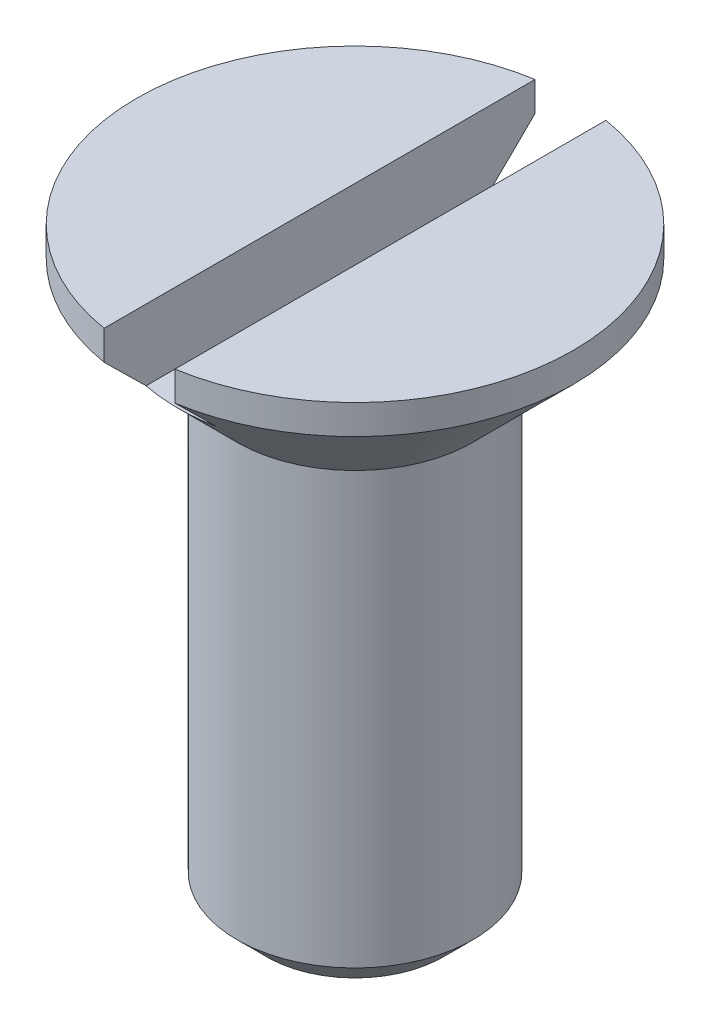
ISO-10303-21;
HEADER;
FILE_DESCRIPTION(('STEP AP214'),'2;1');
FILE_NAME('part.step','',(''),(''),'','','');
FILE_SCHEMA(('AUTOMOTIVE_DESIGN { 1 0 10303 214 1 1 1 1 }'));
ENDSEC;
DATA;
#1=APPLICATION_CONTEXT('core data for automotive mechanical design processes');
#2=APPLICATION_PROTOCOL_DEFINITION('international standard','automotive_design',2000,#1);
#3=PRODUCT_CONTEXT('',#1,'mechanical');
#4=PRODUCT('Part','Part','',(#3));
#5=PRODUCT_RELATED_PRODUCT_CATEGORY('part','',(#4));
#6=PRODUCT_DEFINITION_FORMATION('','',#4);
#7=PRODUCT_DEFINITION_CONTEXT('part definition',#1,'design');
#8=PRODUCT_DEFINITION('design','',#6,#7);
#9=PRODUCT_DEFINITION_SHAPE('','',#8);
#10=(LENGTH_UNIT() NAMED_UNIT(*) SI_UNIT(.MILLI.,.METRE.));
#11=(NAMED_UNIT(*) PLANE_ANGLE_UNIT() SI_UNIT($,.RADIAN.));
#12=(NAMED_UNIT(*) SI_UNIT($,.STERADIAN.) SOLID_ANGLE_UNIT());
#13=UNCERTAINTY_MEASURE_WITH_UNIT(LENGTH_MEASURE(1.E-05),#10,'distance_accuracy_value','');
#14=(GEOMETRIC_REPRESENTATION_CONTEXT(3) GLOBAL_UNCERTAINTY_ASSIGNED_CONTEXT((#13)) GLOBAL_UNIT_ASSIGNED_CONTEXT((#10,
#11,#12)) REPRESENTATION_CONTEXT('',''));
#15=CARTESIAN_POINT('',(0.,0.,0.));
#16=DIRECTION('',(0.,0.,1.));
#17=DIRECTION('',(1.,0.,0.));
#18=AXIS2_PLACEMENT_3D('',#15,#16,#17);
#19=CARTESIAN_POINT('',(-3.7,10.,0.));
#20=DIRECTION('',(0.,1.,0.));
#21=DIRECTION('',(-1.,0.,0.));
#22=AXIS2_PLACEMENT_3D('',#19,#20,#21);
#23=PLANE('',#22);
#24=DIRECTION('',(0.,0.,1.));
#25=VECTOR('',#24,1.);
#26=CARTESIAN_POINT('',(-0.6,10.,-3.7));
#27=LINE('',#26,#25);
#28=CARTESIAN_POINT('',(-0.6,10.,-3.65102725270574));
#29=VERTEX_POINT('',#28);
#30=CARTESIAN_POINT('',(-0.6,10.,3.65102725270574));
#31=VERTEX_POINT('',#30);
#32=EDGE_CURVE('E136',#29,#31,#27,.T.);
#33=ORIENTED_EDGE('',*,*,#32,.F.);
#34=CARTESIAN_POINT('',(0.,10.,0.));
#35=DIRECTION('',(0.,1.,0.));
#36=DIRECTION('',(-1.,0.,0.));
#37=AXIS2_PLACEMENT_3D('',#34,#35,#36);
#38=CIRCLE('',#37,3.7);
#39=EDGE_CURVE('E113',#29,#31,#38,.T.);
#40=ORIENTED_EDGE('',*,*,#39,.T.);
#41=EDGE_LOOP('',(#33,#40));
#42=FACE_BOUND('',#41,.T.);
#43=ADVANCED_FACE('F29',(#42),#23,.T.);
#44=CARTESIAN_POINT('',(0.,10.,0.));
#45=DIRECTION('',(0.,1.,0.));
#46=DIRECTION('',(-1.,0.,0.));
#47=AXIS2_PLACEMENT_3D('',#44,#45,#46);
#48=CYLINDRICAL_SURFACE('',#47,3.7);
#49=DIRECTION('',(0.,1.,0.));
#50=VECTOR('',#49,1.);
#51=CARTESIAN_POINT('',(-0.6,10.,3.65102725270574));
#52=LINE('',#51,#50);
#53=CARTESIAN_POINT('',(-0.6,9.50000000000002,3.65102725270574));
#54=VERTEX_POINT('',#53);
#55=EDGE_CURVE('E57',#31,#54,#52,.F.);
#56=ORIENTED_EDGE('',*,*,#55,.F.);
#57=ORIENTED_EDGE('',*,*,#39,.F.);
#58=DIRECTION('',(0.,1.,0.));
#59=VECTOR('',#58,1.);
#60=CARTESIAN_POINT('',(-0.6,10.,-3.65102725270574));
#61=LINE('',#60,#59);
#62=CARTESIAN_POINT('',(-0.6,9.50000000000002,-3.65102725270574));
#63=VERTEX_POINT('',#62);
#64=EDGE_CURVE('E130',#63,#29,#61,.T.);
#65=ORIENTED_EDGE('',*,*,#64,.F.);
#66=CARTESIAN_POINT('',(0.,9.50000000000002,0.));
#67=DIRECTION('',(0.,1.,0.));
#68=DIRECTION('',(-1.,0.,0.));
#69=AXIS2_PLACEMENT_3D('',#66,#67,#68);
#70=CIRCLE('',#69,3.7);
#71=EDGE_CURVE('E117',#63,#54,#70,.T.);
#72=ORIENTED_EDGE('',*,*,#71,.T.);
#73=EDGE_LOOP('',(#56,#57,#65,#72));
#74=FACE_BOUND('',#73,.T.);
#75=ADVANCED_FACE('F146',(#74),#48,.T.);
#76=DIRECTION('',(0.,0.,1.));
#77=VECTOR('',#76,1.);
#78=CARTESIAN_POINT('',(0.6,10.,-3.7));
#79=LINE('',#78,#77);
#80=CARTESIAN_POINT('',(0.6,10.,-3.65102725270574));
#81=VERTEX_POINT('',#80);
#82=CARTESIAN_POINT('',(0.6,10.,3.65102725270574));
#83=VERTEX_POINT('',#82);
#84=EDGE_CURVE('E100',#81,#83,#79,.T.);
#85=ORIENTED_EDGE('',*,*,#84,.T.);
#86=EDGE_CURVE('E111',#83,#81,#38,.T.);
#87=ORIENTED_EDGE('',*,*,#86,.T.);
#88=EDGE_LOOP('',(#85,#87));
#89=FACE_BOUND('',#88,.T.);
#90=ADVANCED_FACE('F31',(#89),#23,.T.);
#91=DIRECTION('',(0.,1.,0.));
#92=VECTOR('',#91,1.);
#93=CARTESIAN_POINT('',(0.6,10.,-3.65102725270574));
#94=LINE('',#93,#92);
#95=CARTESIAN_POINT('',(0.6,9.50000000000002,-3.65102725270574));
#96=VERTEX_POINT('',#95);
#97=EDGE_CURVE('E132',#81,#96,#94,.F.);
#98=ORIENTED_EDGE('',*,*,#97,.F.);
#99=ORIENTED_EDGE('',*,*,#86,.F.);
#100=DIRECTION('',(0.,1.,0.));
#101=VECTOR('',#100,1.);
#102=CARTESIAN_POINT('',(0.6,10.,3.65102725270574));
#103=LINE('',#102,#101);
#104=CARTESIAN_POINT('',(0.6,9.50000000000002,3.65102725270574));
#105=VERTEX_POINT('',#104);
#106=EDGE_CURVE('E134',#105,#83,#103,.T.);
#107=ORIENTED_EDGE('',*,*,#106,.F.);
#108=EDGE_CURVE('E106',#105,#96,#70,.T.);
#109=ORIENTED_EDGE('',*,*,#108,.T.);
#110=EDGE_LOOP('',(#98,#99,#107,#109));
#111=FACE_BOUND('',#110,.T.);
#112=ADVANCED_FACE('F153',(#111),#48,.T.);
#113=CARTESIAN_POINT('',(0.,9.50000000000002,0.));
#114=DIRECTION('',(0.,1.,0.));
#115=DIRECTION('',(-1.,0.,0.));
#116=AXIS2_PLACEMENT_3D('',#113,#114,#115);
#117=CONICAL_SURFACE('',#116,3.7,0.785398163397443);
#118=CARTESIAN_POINT('',(-0.600000000000001,13.9600206241956,8.13793196010485));
#119=CARTESIAN_POINT('',(-0.600000000000001,13.6768912812845,7.85402777231897));
#120=CARTESIAN_POINT('',(-0.600000000000001,13.3937960861909,7.57008950002176));
#121=CARTESIAN_POINT('',(-0.600000000000001,12.8277099701475,7.00209082271698));
#122=CARTESIAN_POINT('',(-0.600000000000001,12.5447190528461,6.71803041407335));
#123=CARTESIAN_POINT('',(-0.6,11.9786826072545,6.14953775036886));
#124=CARTESIAN_POINT('',(-0.6,11.6956371983772,5.86510537638401));
#125=CARTESIAN_POINT('',(-0.6,11.1297993439922,5.29600682483286));
#126=CARTESIAN_POINT('',(-0.6,10.8470068908349,5.01134065487301));
#127=CARTESIAN_POINT('',(-0.6,10.2857333258305,4.44556875001048));
#128=CARTESIAN_POINT('',(-0.6,10.0072468080645,4.16446838236597));
#129=CARTESIAN_POINT('',(-0.6,9.59002402076898,3.74228982182657));
#130=CARTESIAN_POINT('',(-0.6,9.45102756858926,3.60146883259403));
#131=CARTESIAN_POINT('',(-0.6,9.17328458074779,3.31958319518965));
#132=CARTESIAN_POINT('',(-0.6,9.0345380427178,3.17851854935184));
#133=CARTESIAN_POINT('',(-0.6,8.7574716483417,2.89609946410978));
#134=CARTESIAN_POINT('',(-0.6,8.6191516232573,2.75474519043096));
#135=CARTESIAN_POINT('',(-0.6,8.34307152650493,2.47148070482769));
#136=CARTESIAN_POINT('',(-0.6,8.20531147549013,2.32957047277055));
#137=CARTESIAN_POINT('',(-0.6,7.93074167412053,2.04487556787214));
#138=CARTESIAN_POINT('',(-0.6,7.79393176803235,1.90209104591261));
#139=CARTESIAN_POINT('',(-0.6,7.59005283805898,1.68665676476746));
#140=CARTESIAN_POINT('',(-0.6,7.52231783944741,1.61463791010644));
#141=CARTESIAN_POINT('',(-0.6,7.38750438125967,1.4699889932015));
#142=CARTESIAN_POINT('',(-0.599999999999999,7.3204259074044,1.39735894431496));
#143=CARTESIAN_POINT('',(-0.599999999999999,7.21737067452687,1.28421539613837));
#144=CARTESIAN_POINT('',(-0.599999999999999,7.18104052020518,1.24402402952271));
#145=CARTESIAN_POINT('',(-0.599999999999999,7.10877701321241,1.16328117926467));
#146=CARTESIAN_POINT('',(-0.599999999999999,7.07284368408855,1.12272967450692));
#147=CARTESIAN_POINT('',(-0.599999999999999,7.0013920679676,1.04102691374381));
#148=CARTESIAN_POINT('',(-0.599999999999999,6.96587552547039,0.99987412858094));
#149=CARTESIAN_POINT('',(-0.599999999999999,6.89558487643355,0.916946976871494));
#150=CARTESIAN_POINT('',(-0.599999999999999,6.86081066138162,0.875172702709308));
#151=CARTESIAN_POINT('',(-0.599999999999999,6.79510737046944,0.794199307952508));
#152=CARTESIAN_POINT('',(-0.599999999999999,6.76409575648193,0.755067466057448));
#153=CARTESIAN_POINT('',(-0.599999999999999,6.70336797523996,0.675813657835008));
#154=CARTESIAN_POINT('',(-0.599999999999999,6.67365157281672,0.635691873338648));
#155=CARTESIAN_POINT('',(-0.599999999999999,6.61622665647741,0.55413518197005));
#156=CARTESIAN_POINT('',(-0.599999999999999,6.58851442849082,0.512702919788466));
#157=CARTESIAN_POINT('',(-0.599999999999999,6.53621522205618,0.42793542507467));
#158=CARTESIAN_POINT('',(-0.599999999999999,6.51162392023787,0.384602939456319));
#159=CARTESIAN_POINT('',(-0.599999999999999,6.47077124344621,0.301726491885901));
#160=CARTESIAN_POINT('',(-0.599999999999999,6.45382070718996,0.262532602955207));
#161=CARTESIAN_POINT('',(-0.599999999999999,6.42590828603837,0.182109312015812));
#162=CARTESIAN_POINT('',(-0.599999999999999,6.41492295078953,0.140888585704839));
#163=CARTESIAN_POINT('',(-0.599999999999999,6.402410068702,0.063924785807578));
#164=CARTESIAN_POINT('',(-0.599999999999999,6.39962349148702,0.0283967599025284));
#165=CARTESIAN_POINT('',(-0.599999999999999,6.40046012470945,-0.0425631065150472));
#166=CARTESIAN_POINT('',(-0.599999999999999,6.40408119868653,-0.0779949751437818));
#167=CARTESIAN_POINT('',(-0.599999999999999,6.41911086130069,-0.159349986954465));
#168=CARTESIAN_POINT('',(-0.599999999999999,6.43270391393231,-0.204855293705313));
#169=CARTESIAN_POINT('',(-0.599999999999999,6.4581067891676,-0.271162915462734));
#170=CARTESIAN_POINT('',(-0.599999999999999,6.46744883758506,-0.293008638455443));
#171=CARTESIAN_POINT('',(-0.599999999999999,6.48745397120612,-0.336087239478985));
#172=CARTESIAN_POINT('',(-0.599999999999999,6.49811672299072,-0.357320270525163));
#173=CARTESIAN_POINT('',(-0.599999999999999,6.52939555581037,-0.415982831640738));
#174=CARTESIAN_POINT('',(-0.599999999999999,6.55115624380446,-0.452795694277313));
#175=CARTESIAN_POINT('',(-0.599999999999999,6.59682208128606,-0.525077964984181));
#176=CARTESIAN_POINT('',(-0.599999999999999,6.62072901479264,-0.560546219893624));
#177=CARTESIAN_POINT('',(-0.599999999999999,6.67004195715454,-0.630548437000614));
#178=CARTESIAN_POINT('',(-0.599999999999999,6.69545152537907,-0.665079873092601));
#179=CARTESIAN_POINT('',(-0.599999999999999,6.74728510442056,-0.733375806005273));
#180=CARTESIAN_POINT('',(-0.599999999999999,6.77370928127676,-0.767140175845282));
#181=CARTESIAN_POINT('',(-0.599999999999999,6.85434134965783,-0.867919244140588));
#182=CARTESIAN_POINT('',(-0.599999999999999,6.9096425797587,-0.934056109051674));
#183=CARTESIAN_POINT('',(-0.599999999999999,7.02176654130162,-1.06481071116443));
#184=CARTESIAN_POINT('',(-0.599999999999999,7.0785865034983,-1.12943085704488));
#185=CARTESIAN_POINT('',(-0.599999999999999,7.19241187106198,-1.25682824367005));
#186=CARTESIAN_POINT('',(-0.6,7.24940259970984,-1.31961861941935));
#187=CARTESIAN_POINT('',(-0.6,7.36404478846876,-1.44459287058122));
#188=CARTESIAN_POINT('',(-0.6,7.42169625897603,-1.50677673642228));
#189=CARTESIAN_POINT('',(-0.6,7.59534223900285,-1.69270278432733));
#190=CARTESIAN_POINT('',(-0.6,7.71201793375945,-1.81580796723868));
#191=CARTESIAN_POINT('',(-0.6,7.94644280759326,-2.0611887484764));
#192=CARTESIAN_POINT('',(-0.6,8.06419282008437,-2.18346354647023));
#193=CARTESIAN_POINT('',(-0.6,8.30028890308813,-2.42742423040907));
#194=CARTESIAN_POINT('',(-0.6,8.41863494334991,-2.54911014563969));
#195=CARTESIAN_POINT('',(-0.6,8.65500717812537,-2.79137280615526));
#196=CARTESIAN_POINT('',(-0.6,8.77303104136324,-2.91195182898462));
#197=CARTESIAN_POINT('',(-0.6,9.00934781550322,-3.15284893689326));
#198=CARTESIAN_POINT('',(-0.6,9.12764072989199,-3.27316701855104));
#199=CARTESIAN_POINT('',(-0.6,9.48272713697431,-3.63376526150932));
#200=CARTESIAN_POINT('',(-0.6,9.71980374699238,-3.87376652863276));
#201=CARTESIAN_POINT('',(-0.6,10.2886319592405,-4.44861133790146));
#202=CARTESIAN_POINT('',(-0.6,10.6205820339943,-4.7832583028993));
#203=CARTESIAN_POINT('',(-0.6,11.2849478138358,-5.45216769917098));
#204=CARTESIAN_POINT('',(-0.6,11.6173635691108,-5.78643008057178));
#205=CARTESIAN_POINT('',(-0.6,12.2847457930005,-6.4570128556582));
#206=CARTESIAN_POINT('',(-0.6,12.6197140122828,-6.79333150662993));
#207=CARTESIAN_POINT('',(-0.600000000000001,13.2897808105559,-7.46575829971184));
#208=CARTESIAN_POINT('',(-0.600000000000001,13.6248793690147,-7.80186646228028));
#209=CARTESIAN_POINT('',(-0.600000000000001,13.9600206241956,-8.13793196010485));
#210=B_SPLINE_CURVE_WITH_KNOTS('',3,(#118,#119,#120,#121,#122,#123,#124,#125,#126,#127,#128,
#129,#130,#131,#132,#133,#134,#135,#136,#137,#138,#139,#140,#141,#142,#143,#144,#145,#146,#147,
#148,#149,#150,#151,#152,#153,#154,#155,#156,#157,#158,#159,#160,#161,#162,#163,#164,#165,#166,
#167,#168,#169,#170,#171,#172,#173,#174,#175,#176,#177,#178,#179,#180,#181,#182,#183,#184,#185,
#186,#187,#188,#189,#190,#191,#192,#193,#194,#195,#196,#197,#198,#199,#200,#201,#202,#203,#204,
#205,#206,#207,#208,#209),.UNSPECIFIED.,.F.,.F.,(4,2,2,2,2,2,2,2,2,2,2,2,2,2,2,2,2,2,2,2,2,2,2,
2,2,2,2,2,2,2,2,2,2,2,2,2,2,2,2,2,2,2,2,2,2,4),(0.,1.20286091475452,2.40576053584867,
3.6095661884296,4.81333411531858,6.00040930817248,6.59400413473686,7.18759330634946,
7.78090579697012,8.37423997531859,8.96747449255333,9.26407415171825,9.5606673455807,
9.72319861560583,9.88573947880689,10.0488126207255,10.2118617593269,10.3616347814149,
10.5113804952798,10.6608411897885,10.8100925247216,10.9379019301194,11.0652051861339,
11.1715563779878,11.2778721165553,11.4194479223042,11.4907036241509,11.5619413736212,
11.6901080531411,11.8183822726337,11.9469735623142,12.075585986218,12.3341618029343,
12.5922945826552,12.8466786122313,13.1010666498339,13.6098890890932,14.1191470825747,
14.6283794844877,15.1345611743107,15.6407494616195,16.6528023877671,18.0668791450929,
19.4811222704145,20.9051395740233,22.3289855542461),.UNSPECIFIED.);
#211=CARTESIAN_POINT('',(-0.6,8.8,2.9393876913398));
#212=VERTEX_POINT('',#211);
#213=EDGE_CURVE('E11',#54,#212,#210,.T.);
#214=ORIENTED_EDGE('',*,*,#213,.F.);
#215=ORIENTED_EDGE('',*,*,#71,.F.);
#216=CARTESIAN_POINT('',(-0.6,8.8,-2.9393876913398));
#217=VERTEX_POINT('',#216);
#218=EDGE_CURVE('E33',#217,#63,#210,.T.);
#219=ORIENTED_EDGE('',*,*,#218,.F.);
#220=CARTESIAN_POINT('',(0.,8.8,0.));
#221=DIRECTION('',(0.,-1.,0.));
#222=DIRECTION('',(0.,0.,-1.));
#223=AXIS2_PLACEMENT_3D('',#220,#221,#222);
#224=CIRCLE('',#223,2.99999999999999);
#225=CARTESIAN_POINT('',(0.6,8.8,-2.9393876913398));
#226=VERTEX_POINT('',#225);
#227=EDGE_CURVE('E93',#226,#217,#224,.F.);
#228=ORIENTED_EDGE('',*,*,#227,.F.);
#229=CARTESIAN_POINT('',(0.600000000000001,13.9600206241956,-8.13793196010485));
#230=CARTESIAN_POINT('',(0.600000000000001,13.6768912812845,-7.85402777231896));
#231=CARTESIAN_POINT('',(0.600000000000001,13.3937960861909,-7.57008950002176));
#232=CARTESIAN_POINT('',(0.600000000000001,12.8277099701474,-7.00209082271698));
#233=CARTESIAN_POINT('',(0.600000000000001,12.5447190528461,-6.71803041407335));
#234=CARTESIAN_POINT('',(0.6,11.9786826072545,-6.14953775036886));
#235=CARTESIAN_POINT('',(0.6,11.6956371983772,-5.86510537638401));
#236=CARTESIAN_POINT('',(0.6,11.1297993439922,-5.29600682483286));
#237=CARTESIAN_POINT('',(0.6,10.8470068908349,-5.01134065487301));
#238=CARTESIAN_POINT('',(0.6,10.2857333258305,-4.44556875001048));
#239=CARTESIAN_POINT('',(0.6,10.0072468080645,-4.16446838236597));
#240=CARTESIAN_POINT('',(0.6,9.59002402076898,-3.74228982182657));
#241=CARTESIAN_POINT('',(0.6,9.45102756858926,-3.60146883259403));
#242=CARTESIAN_POINT('',(0.6,9.17328458074779,-3.31958319518965));
#243=CARTESIAN_POINT('',(0.6,9.0345380427178,-3.17851854935184));
#244=CARTESIAN_POINT('',(0.6,8.75747164834171,-2.89609946410979));
#245=CARTESIAN_POINT('',(0.6,8.6191516232573,-2.75474519043096));
#246=CARTESIAN_POINT('',(0.6,8.34307152650494,-2.47148070482769));
#247=CARTESIAN_POINT('',(0.6,8.20531147549013,-2.32957047277055));
#248=CARTESIAN_POINT('',(0.6,7.93074167412053,-2.04487556787214));
#249=CARTESIAN_POINT('',(0.6,7.79393176803235,-1.90209104591261));
#250=CARTESIAN_POINT('',(0.6,7.59005283805898,-1.68665676476746));
#251=CARTESIAN_POINT('',(0.6,7.52231783944741,-1.61463791010643));
#252=CARTESIAN_POINT('',(0.6,7.38750438125967,-1.4699889932015));
#253=CARTESIAN_POINT('',(0.599999999999999,7.3204259074044,-1.39735894431496));
#254=CARTESIAN_POINT('',(0.599999999999999,7.21737067452687,-1.28421539613837));
#255=CARTESIAN_POINT('',(0.599999999999999,7.18104052020518,-1.24402402952271));
#256=CARTESIAN_POINT('',(0.599999999999999,7.10877701321241,-1.16328117926467));
#257=CARTESIAN_POINT('',(0.599999999999999,7.07284368408855,-1.12272967450692));
#258=CARTESIAN_POINT('',(0.599999999999999,7.0013920679676,-1.04102691374381));
#259=CARTESIAN_POINT('',(0.599999999999999,6.96587552547039,-0.99987412858094));
#260=CARTESIAN_POINT('',(0.599999999999999,6.89558487643355,-0.916946976871493));
#261=CARTESIAN_POINT('',(0.599999999999999,6.86081066138162,-0.875172702709308));
#262=CARTESIAN_POINT('',(0.599999999999999,6.79510737046944,-0.794199307952508));
#263=CARTESIAN_POINT('',(0.599999999999999,6.76409575648193,-0.755067466057447));
#264=CARTESIAN_POINT('',(0.599999999999999,6.70336797523996,-0.675813657835008));
#265=CARTESIAN_POINT('',(0.599999999999999,6.67365157281672,-0.635691873338648));
#266=CARTESIAN_POINT('',(0.599999999999999,6.61622665647741,-0.554135181970051));
#267=CARTESIAN_POINT('',(0.599999999999999,6.58851442849082,-0.512702919788467));
#268=CARTESIAN_POINT('',(0.599999999999999,6.53621522205618,-0.42793542507467));
#269=CARTESIAN_POINT('',(0.599999999999999,6.51162392023787,-0.384602939456319));
#270=CARTESIAN_POINT('',(0.599999999999999,6.47077124344621,-0.3017264918859));
#271=CARTESIAN_POINT('',(0.599999999999999,6.45382070718996,-0.262532602955206));
#272=CARTESIAN_POINT('',(0.599999999999999,6.42590828603837,-0.182109312015812));
#273=CARTESIAN_POINT('',(0.599999999999999,6.41492295078953,-0.140888585704839));
#274=CARTESIAN_POINT('',(0.599999999999999,6.402410068702,-0.0639247858075774));
#275=CARTESIAN_POINT('',(0.599999999999999,6.39962349148702,-0.0283967599025279));
#276=CARTESIAN_POINT('',(0.599999999999999,6.40046012470945,0.0425631065150478));
#277=CARTESIAN_POINT('',(0.599999999999999,6.40408119868653,0.0779949751437825));
#278=CARTESIAN_POINT('',(0.599999999999999,6.4191108613007,0.159349986954465));
#279=CARTESIAN_POINT('',(0.599999999999999,6.43270391393231,0.204855293705314));
#280=CARTESIAN_POINT('',(0.599999999999999,6.4581067891676,0.271162915462734));
#281=CARTESIAN_POINT('',(0.599999999999999,6.46744883758506,0.293008638455443));
#282=CARTESIAN_POINT('',(0.599999999999999,6.48745397120612,0.336087239478985));
#283=CARTESIAN_POINT('',(0.599999999999999,6.49811672299072,0.357320270525164));
#284=CARTESIAN_POINT('',(0.599999999999999,6.52939555581037,0.41598283164074));
#285=CARTESIAN_POINT('',(0.599999999999999,6.55115624380447,0.452795694277316));
#286=CARTESIAN_POINT('',(0.599999999999999,6.59682208128606,0.525077964984184));
#287=CARTESIAN_POINT('',(0.599999999999999,6.62072901479264,0.560546219893627));
#288=CARTESIAN_POINT('',(0.599999999999999,6.67004195715454,0.630548437000617));
#289=CARTESIAN_POINT('',(0.599999999999999,6.69545152537907,0.665079873092604));
#290=CARTESIAN_POINT('',(0.599999999999999,6.74728510442057,0.733375806005276));
#291=CARTESIAN_POINT('',(0.599999999999999,6.77370928127676,0.767140175845284));
#292=CARTESIAN_POINT('',(0.599999999999999,6.85434134965783,0.867919244140591));
#293=CARTESIAN_POINT('',(0.599999999999999,6.90964257975871,0.934056109051677));
#294=CARTESIAN_POINT('',(0.599999999999999,7.02176654130162,1.06481071116444));
#295=CARTESIAN_POINT('',(0.599999999999999,7.07858650349831,1.12943085704488));
#296=CARTESIAN_POINT('',(0.599999999999999,7.19241187106198,1.25682824367005));
#297=CARTESIAN_POINT('',(0.6,7.24940259970984,1.31961861941936));
#298=CARTESIAN_POINT('',(0.6,7.36404478846877,1.44459287058122));
#299=CARTESIAN_POINT('',(0.6,7.42169625897604,1.50677673642228));
#300=CARTESIAN_POINT('',(0.6,7.59534223900286,1.69270278432734));
#301=CARTESIAN_POINT('',(0.6,7.71201793375946,1.81580796723869));
#302=CARTESIAN_POINT('',(0.6,7.94644280759327,2.06118874847641));
#303=CARTESIAN_POINT('',(0.6,8.06419282008438,2.18346354647024));
#304=CARTESIAN_POINT('',(0.6,8.30028890308813,2.42742423040908));
#305=CARTESIAN_POINT('',(0.6,8.41863494334992,2.5491101456397));
#306=CARTESIAN_POINT('',(0.6,8.65500717812538,2.79137280615527));
#307=CARTESIAN_POINT('',(0.6,8.77303104136325,2.91195182898463));
#308=CARTESIAN_POINT('',(0.6,9.00934781550323,3.15284893689327));
#309=CARTESIAN_POINT('',(0.6,9.127640729892,3.27316701855106));
#310=CARTESIAN_POINT('',(0.6,9.48272713697433,3.63376526150934));
#311=CARTESIAN_POINT('',(0.6,9.7198037469924,3.87376652863278));
#312=CARTESIAN_POINT('',(0.6,10.2886319592406,4.44861133790148));
#313=CARTESIAN_POINT('',(0.6,10.6205820339943,4.78325830289932));
#314=CARTESIAN_POINT('',(0.6,11.2849478138358,5.45216769917099));
#315=CARTESIAN_POINT('',(0.6,11.6173635691109,5.7864300805718));
#316=CARTESIAN_POINT('',(0.6,12.2847457930006,6.45701285565821));
#317=CARTESIAN_POINT('',(0.6,12.6197140122828,6.79333150662994));
#318=CARTESIAN_POINT('',(0.600000000000001,13.2897808105559,7.46575829971185));
#319=CARTESIAN_POINT('',(0.600000000000001,13.6248793690147,7.80186646228028));
#320=CARTESIAN_POINT('',(0.600000000000001,13.9600206241956,8.13793196010485));
#321=B_SPLINE_CURVE_WITH_KNOTS('',3,(#229,#230,#231,#232,#233,#234,#235,#236,#237,#238,#239,
#240,#241,#242,#243,#244,#245,#246,#247,#248,#249,#250,#251,#252,#253,#254,#255,#256,#257,#258,
#259,#260,#261,#262,#263,#264,#265,#266,#267,#268,#269,#270,#271,#272,#273,#274,#275,#276,#277,
#278,#279,#280,#281,#282,#283,#284,#285,#286,#287,#288,#289,#290,#291,#292,#293,#294,#295,#296,
#297,#298,#299,#300,#301,#302,#303,#304,#305,#306,#307,#308,#309,#310,#311,#312,#313,#314,#315,
#316,#317,#318,#319,#320),.UNSPECIFIED.,.F.,.F.,(4,2,2,2,2,2,2,2,2,2,2,2,2,2,2,2,2,2,2,2,2,2,2,
2,2,2,2,2,2,2,2,2,2,2,2,2,2,2,2,2,2,2,2,2,2,4),(0.,1.20286091475452,2.40576053584867,
3.6095661884296,4.81333411531857,6.00040930817248,6.59400413473685,7.18759330634945,
7.78090579697012,8.37423997531859,8.96747449255333,9.26407415171824,9.5606673455807,
9.72319861560583,9.88573947880689,10.0488126207255,10.2118617593269,10.3616347814149,
10.5113804952798,10.6608411897885,10.8100925247216,10.9379019301194,11.0652051861339,
11.1715563779878,11.2778721165553,11.4194479223042,11.4907036241509,11.5619413736212,
11.6901080531411,11.8183822726337,11.9469735623142,12.075585986218,12.3341618029343,
12.5922945826552,12.8466786122313,13.1010666498339,13.6098890890932,14.1191470825747,
14.6283794844877,15.1345611743107,15.6407494616195,16.6528023877672,18.0668791450929,
19.4811222704145,20.9051395740233,22.3289855542461),.UNSPECIFIED.);
#322=EDGE_CURVE('E98',#96,#226,#321,.T.);
#323=ORIENTED_EDGE('',*,*,#322,.F.);
#324=ORIENTED_EDGE('',*,*,#108,.F.);
#325=CARTESIAN_POINT('',(0.6,8.8,2.9393876913398));
#326=VERTEX_POINT('',#325);
#327=EDGE_CURVE('E43',#326,#105,#321,.T.);
#328=ORIENTED_EDGE('',*,*,#327,.F.);
#329=EDGE_CURVE('E86',#212,#326,#224,.F.);
#330=ORIENTED_EDGE('',*,*,#329,.F.);
#331=EDGE_LOOP('',(#214,#215,#219,#228,#323,#324,#328,#330));
#332=FACE_BOUND('',#331,.T.);
#333=CARTESIAN_POINT('',(0.,7.8,0.));
#334=DIRECTION('',(0.,1.,0.));
#335=DIRECTION('',(-1.,0.,0.));
#336=AXIS2_PLACEMENT_3D('',#333,#334,#335);
#337=CIRCLE('',#336,2.);
#338=CARTESIAN_POINT('',(-2.,7.8,0.));
#339=VERTEX_POINT('',#338);
#340=EDGE_CURVE('E120',#339,#339,#337,.T.);
#341=ORIENTED_EDGE('',*,*,#340,.T.);
#342=EDGE_LOOP('',(#341));
#343=FACE_BOUND('',#342,.T.);
#344=ADVANCED_FACE('F103',(#332,#343),#117,.T.);
#345=CARTESIAN_POINT('',(0.,10.,0.));
#346=DIRECTION('',(0.,1.,0.));
#347=DIRECTION('',(-1.,0.,0.));
#348=AXIS2_PLACEMENT_3D('',#345,#346,#347);
#349=CYLINDRICAL_SURFACE('',#348,2.);
#350=CARTESIAN_POINT('',(0.,0.499999999999997,0.));
#351=DIRECTION('',(0.,1.,0.));
#352=DIRECTION('',(-1.,0.,0.));
#353=AXIS2_PLACEMENT_3D('',#350,#351,#352);
#354=CIRCLE('',#353,2.);
#355=CARTESIAN_POINT('',(-2.,0.499999999999997,0.));
#356=VERTEX_POINT('',#355);
#357=EDGE_CURVE('E123',#356,#356,#354,.T.);
#358=ORIENTED_EDGE('',*,*,#357,.T.);
#359=EDGE_LOOP('',(#358));
#360=FACE_BOUND('',#359,.T.);
#361=ORIENTED_EDGE('',*,*,#340,.F.);
#362=EDGE_LOOP('',(#361));
#363=FACE_BOUND('',#362,.T.);
#364=ADVANCED_FACE('F166',(#360,#363),#349,.T.);
#365=CARTESIAN_POINT('',(0.,0.499999999999997,0.));
#366=DIRECTION('',(0.,1.,0.));
#367=DIRECTION('',(-1.,0.,0.));
#368=AXIS2_PLACEMENT_3D('',#365,#366,#367);
#369=CONICAL_SURFACE('',#368,2.,0.78539816339745);
#370=CARTESIAN_POINT('',(0.,0.,0.));
#371=DIRECTION('',(0.,1.,0.));
#372=DIRECTION('',(-1.,0.,0.));
#373=AXIS2_PLACEMENT_3D('',#370,#371,#372);
#374=CIRCLE('',#373,1.5);
#375=CARTESIAN_POINT('',(-1.5,0.,0.));
#376=VERTEX_POINT('',#375);
#377=EDGE_CURVE('E126',#376,#376,#374,.T.);
#378=ORIENTED_EDGE('',*,*,#377,.T.);
#379=EDGE_LOOP('',(#378));
#380=FACE_BOUND('',#379,.T.);
#381=ORIENTED_EDGE('',*,*,#357,.F.);
#382=EDGE_LOOP('',(#381));
#383=FACE_BOUND('',#382,.T.);
#384=ADVANCED_FACE('F172',(#380,#383),#369,.T.);
#385=CARTESIAN_POINT('',(0.,0.,0.));
#386=DIRECTION('',(0.,-1.,0.));
#387=DIRECTION('',(1.,0.,0.));
#388=AXIS2_PLACEMENT_3D('',#385,#386,#387);
#389=PLANE('',#388);
#390=ORIENTED_EDGE('',*,*,#377,.F.);
#391=EDGE_LOOP('',(#390));
#392=FACE_BOUND('',#391,.T.);
#393=ADVANCED_FACE('F176',(#392),#389,.T.);
#394=CARTESIAN_POINT('',(-0.6,10.,-3.7));
#395=DIRECTION('',(-1.,0.,0.));
#396=DIRECTION('',(0.,-1.,0.));
#397=AXIS2_PLACEMENT_3D('',#394,#395,#396);
#398=PLANE('',#397);
#399=ORIENTED_EDGE('',*,*,#55,.T.);
#400=ORIENTED_EDGE('',*,*,#213,.T.);
#401=DIRECTION('',(0.,0.,1.));
#402=VECTOR('',#401,1.);
#403=CARTESIAN_POINT('',(-0.6,8.8,-3.7));
#404=LINE('',#403,#402);
#405=EDGE_CURVE('E89',#217,#212,#404,.T.);
#406=ORIENTED_EDGE('',*,*,#405,.F.);
#407=ORIENTED_EDGE('',*,*,#218,.T.);
#408=ORIENTED_EDGE('',*,*,#64,.T.);
#409=ORIENTED_EDGE('',*,*,#32,.T.);
#410=EDGE_LOOP('',(#399,#400,#406,#407,#408,#409));
#411=FACE_BOUND('',#410,.T.);
#412=ADVANCED_FACE('F141',(#411),#398,.F.);
#413=CARTESIAN_POINT('',(0.6,10.,-3.7));
#414=DIRECTION('',(1.,0.,0.));
#415=DIRECTION('',(0.,1.,0.));
#416=AXIS2_PLACEMENT_3D('',#413,#414,#415);
#417=PLANE('',#416);
#418=ORIENTED_EDGE('',*,*,#97,.T.);
#419=ORIENTED_EDGE('',*,*,#322,.T.);
#420=DIRECTION('',(0.,0.,1.));
#421=VECTOR('',#420,1.);
#422=CARTESIAN_POINT('',(0.6,8.8,-3.7));
#423=LINE('',#422,#421);
#424=EDGE_CURVE('E50',#226,#326,#423,.T.);
#425=ORIENTED_EDGE('',*,*,#424,.T.);
#426=ORIENTED_EDGE('',*,*,#327,.T.);
#427=ORIENTED_EDGE('',*,*,#106,.T.);
#428=ORIENTED_EDGE('',*,*,#84,.F.);
#429=EDGE_LOOP('',(#418,#419,#425,#426,#427,#428));
#430=FACE_BOUND('',#429,.T.);
#431=ADVANCED_FACE('F95',(#430),#417,.F.);
#432=CARTESIAN_POINT('',(-0.6,8.8,-3.7));
#433=DIRECTION('',(0.,-1.,0.));
#434=DIRECTION('',(0.,0.,-1.));
#435=AXIS2_PLACEMENT_3D('',#432,#433,#434);
#436=PLANE('',#435);
#437=ORIENTED_EDGE('',*,*,#329,.T.);
#438=ORIENTED_EDGE('',*,*,#424,.F.);
#439=ORIENTED_EDGE('',*,*,#227,.T.);
#440=ORIENTED_EDGE('',*,*,#405,.T.);
#441=EDGE_LOOP('',(#437,#438,#439,#440));
#442=FACE_BOUND('',#441,.T.);
#443=ADVANCED_FACE('F87',(#442),#436,.F.);
#444=CLOSED_SHELL('',(#43,#75,#90,#112,#344,#364,#384,#393,#412,#431,#443));
#445=MANIFOLD_SOLID_BREP('B2',#444);
#446=ADVANCED_BREP_SHAPE_REPRESENTATION('',(#18,#445),#14);
#447=SHAPE_DEFINITION_REPRESENTATION(#9,#446);
ENDSEC;
END-ISO-10303-21;
